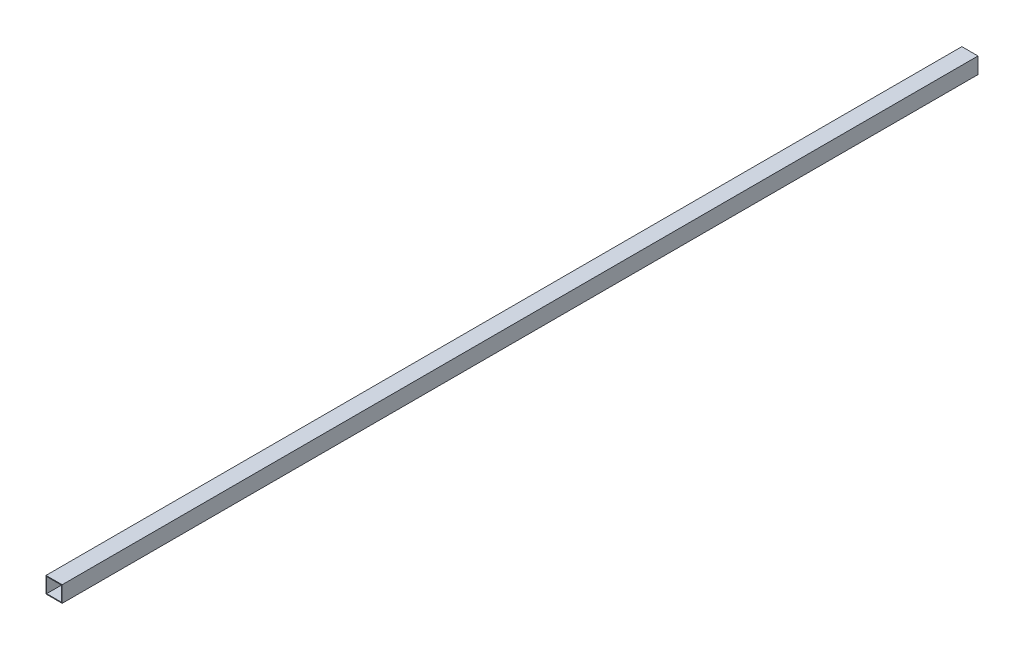
ISO-10303-21;
HEADER;
FILE_DESCRIPTION(('STEP AP214'),'2;1');
FILE_NAME('part.step','',(''),(''),'','','');
FILE_SCHEMA(('AUTOMOTIVE_DESIGN { 1 0 10303 214 1 1 1 1 }'));
ENDSEC;
DATA;
#1=APPLICATION_CONTEXT('core data for automotive mechanical design processes');
#2=APPLICATION_PROTOCOL_DEFINITION('international standard','automotive_design',2000,#1);
#3=PRODUCT_CONTEXT('',#1,'mechanical');
#4=PRODUCT('Part','Part','',(#3));
#5=PRODUCT_RELATED_PRODUCT_CATEGORY('part','',(#4));
#6=PRODUCT_DEFINITION_FORMATION('','',#4);
#7=PRODUCT_DEFINITION_CONTEXT('part definition',#1,'design');
#8=PRODUCT_DEFINITION('design','',#6,#7);
#9=PRODUCT_DEFINITION_SHAPE('','',#8);
#10=(LENGTH_UNIT() NAMED_UNIT(*) SI_UNIT(.MILLI.,.METRE.));
#11=(NAMED_UNIT(*) PLANE_ANGLE_UNIT() SI_UNIT($,.RADIAN.));
#12=(NAMED_UNIT(*) SI_UNIT($,.STERADIAN.) SOLID_ANGLE_UNIT());
#13=UNCERTAINTY_MEASURE_WITH_UNIT(LENGTH_MEASURE(1.E-05),#10,'distance_accuracy_value','');
#14=(GEOMETRIC_REPRESENTATION_CONTEXT(3) GLOBAL_UNCERTAINTY_ASSIGNED_CONTEXT((#13)) GLOBAL_UNIT_ASSIGNED_CONTEXT((#10,
#11,#12)) REPRESENTATION_CONTEXT('',''));
#15=CARTESIAN_POINT('',(0.,0.,0.));
#16=DIRECTION('',(0.,0.,1.));
#17=DIRECTION('',(1.,0.,0.));
#18=AXIS2_PLACEMENT_3D('',#15,#16,#17);
#19=CARTESIAN_POINT('',(0.,0.,2159.));
#20=DIRECTION('',(0.,0.,-1.));
#21=DIRECTION('',(-1.,0.,0.));
#22=AXIS2_PLACEMENT_3D('',#19,#20,#21);
#23=PLANE('',#22);
#24=DIRECTION('',(0.,-1.,0.));
#25=VECTOR('',#24,1.);
#26=CARTESIAN_POINT('',(0.,0.,2159.));
#27=LINE('',#26,#25);
#28=CARTESIAN_POINT('',(0.,38.1,2159.));
#29=VERTEX_POINT('',#28);
#30=CARTESIAN_POINT('',(0.,0.,2159.));
#31=VERTEX_POINT('',#30);
#32=EDGE_CURVE('E134',#29,#31,#27,.T.);
#33=ORIENTED_EDGE('',*,*,#32,.T.);
#34=DIRECTION('',(1.,0.,0.));
#35=VECTOR('',#34,1.);
#36=CARTESIAN_POINT('',(0.,0.,2159.));
#37=LINE('',#36,#35);
#38=CARTESIAN_POINT('',(38.1,0.,2159.));
#39=VERTEX_POINT('',#38);
#40=EDGE_CURVE('E137',#31,#39,#37,.T.);
#41=ORIENTED_EDGE('',*,*,#40,.T.);
#42=DIRECTION('',(0.,1.,0.));
#43=VECTOR('',#42,1.);
#44=CARTESIAN_POINT('',(38.1,0.,2159.));
#45=LINE('',#44,#43);
#46=CARTESIAN_POINT('',(38.1,38.1,2159.));
#47=VERTEX_POINT('',#46);
#48=EDGE_CURVE('E140',#39,#47,#45,.T.);
#49=ORIENTED_EDGE('',*,*,#48,.T.);
#50=DIRECTION('',(-1.,0.,0.));
#51=VECTOR('',#50,1.);
#52=CARTESIAN_POINT('',(0.,38.1,2159.));
#53=LINE('',#52,#51);
#54=EDGE_CURVE('E142',#47,#29,#53,.T.);
#55=ORIENTED_EDGE('',*,*,#54,.T.);
#56=EDGE_LOOP('',(#33,#41,#49,#55));
#57=FACE_BOUND('',#56,.T.);
#58=DIRECTION('',(0.,-1.,0.));
#59=VECTOR('',#58,1.);
#60=CARTESIAN_POINT('',(1.5875,1.5875,2159.));
#61=LINE('',#60,#59);
#62=CARTESIAN_POINT('',(1.5875,36.5125,2159.));
#63=VERTEX_POINT('',#62);
#64=CARTESIAN_POINT('',(1.5875,1.5875,2159.));
#65=VERTEX_POINT('',#64);
#66=EDGE_CURVE('E98',#63,#65,#61,.T.);
#67=ORIENTED_EDGE('',*,*,#66,.F.);
#68=DIRECTION('',(-1.,0.,0.));
#69=VECTOR('',#68,1.);
#70=CARTESIAN_POINT('',(1.5875,36.5125,2159.));
#71=LINE('',#70,#69);
#72=CARTESIAN_POINT('',(36.5125,36.5125,2159.));
#73=VERTEX_POINT('',#72);
#74=EDGE_CURVE('E120',#73,#63,#71,.T.);
#75=ORIENTED_EDGE('',*,*,#74,.F.);
#76=DIRECTION('',(0.,1.,0.));
#77=VECTOR('',#76,1.);
#78=CARTESIAN_POINT('',(36.5125,1.5875,2159.));
#79=LINE('',#78,#77);
#80=CARTESIAN_POINT('',(36.5125,1.5875,2159.));
#81=VERTEX_POINT('',#80);
#82=EDGE_CURVE('E118',#81,#73,#79,.T.);
#83=ORIENTED_EDGE('',*,*,#82,.F.);
#84=DIRECTION('',(1.,0.,0.));
#85=VECTOR('',#84,1.);
#86=CARTESIAN_POINT('',(1.5875,1.5875,2159.));
#87=LINE('',#86,#85);
#88=EDGE_CURVE('E106',#65,#81,#87,.T.);
#89=ORIENTED_EDGE('',*,*,#88,.F.);
#90=EDGE_LOOP('',(#67,#75,#83,#89));
#91=FACE_BOUND('',#90,.T.);
#92=ADVANCED_FACE('F33',(#57,#91),#23,.F.);
#93=CARTESIAN_POINT('',(0.,0.,0.));
#94=DIRECTION('',(0.,0.,-1.));
#95=DIRECTION('',(-1.,0.,0.));
#96=AXIS2_PLACEMENT_3D('',#93,#94,#95);
#97=PLANE('',#96);
#98=DIRECTION('',(0.,-1.,0.));
#99=VECTOR('',#98,1.);
#100=CARTESIAN_POINT('',(0.,0.,0.));
#101=LINE('',#100,#99);
#102=CARTESIAN_POINT('',(0.,38.1,0.));
#103=VERTEX_POINT('',#102);
#104=CARTESIAN_POINT('',(0.,0.,0.));
#105=VERTEX_POINT('',#104);
#106=EDGE_CURVE('E114',#103,#105,#101,.T.);
#107=ORIENTED_EDGE('',*,*,#106,.F.);
#108=DIRECTION('',(-1.,0.,0.));
#109=VECTOR('',#108,1.);
#110=CARTESIAN_POINT('',(0.,38.1,0.));
#111=LINE('',#110,#109);
#112=CARTESIAN_POINT('',(38.1,38.1,0.));
#113=VERTEX_POINT('',#112);
#114=EDGE_CURVE('E138',#113,#103,#111,.T.);
#115=ORIENTED_EDGE('',*,*,#114,.F.);
#116=DIRECTION('',(0.,1.,0.));
#117=VECTOR('',#116,1.);
#118=CARTESIAN_POINT('',(38.1,0.,0.));
#119=LINE('',#118,#117);
#120=CARTESIAN_POINT('',(38.1,0.,0.));
#121=VERTEX_POINT('',#120);
#122=EDGE_CURVE('E149',#121,#113,#119,.T.);
#123=ORIENTED_EDGE('',*,*,#122,.F.);
#124=DIRECTION('',(1.,0.,0.));
#125=VECTOR('',#124,1.);
#126=CARTESIAN_POINT('',(0.,0.,0.));
#127=LINE('',#126,#125);
#128=EDGE_CURVE('E147',#105,#121,#127,.T.);
#129=ORIENTED_EDGE('',*,*,#128,.F.);
#130=EDGE_LOOP('',(#107,#115,#123,#129));
#131=FACE_BOUND('',#130,.T.);
#132=DIRECTION('',(-1.,0.,0.));
#133=VECTOR('',#132,1.);
#134=CARTESIAN_POINT('',(1.5875,36.5125,0.));
#135=LINE('',#134,#133);
#136=CARTESIAN_POINT('',(36.5125,36.5125,0.));
#137=VERTEX_POINT('',#136);
#138=CARTESIAN_POINT('',(1.5875,36.5125,0.));
#139=VERTEX_POINT('',#138);
#140=EDGE_CURVE('E107',#137,#139,#135,.T.);
#141=ORIENTED_EDGE('',*,*,#140,.T.);
#142=DIRECTION('',(0.,-1.,0.));
#143=VECTOR('',#142,1.);
#144=CARTESIAN_POINT('',(1.5875,1.5875,0.));
#145=LINE('',#144,#143);
#146=CARTESIAN_POINT('',(1.5875,1.5875,0.));
#147=VERTEX_POINT('',#146);
#148=EDGE_CURVE('E56',#139,#147,#145,.T.);
#149=ORIENTED_EDGE('',*,*,#148,.T.);
#150=DIRECTION('',(1.,0.,0.));
#151=VECTOR('',#150,1.);
#152=CARTESIAN_POINT('',(1.5875,1.5875,0.));
#153=LINE('',#152,#151);
#154=CARTESIAN_POINT('',(36.5125,1.5875,0.));
#155=VERTEX_POINT('',#154);
#156=EDGE_CURVE('E113',#147,#155,#153,.T.);
#157=ORIENTED_EDGE('',*,*,#156,.T.);
#158=DIRECTION('',(0.,1.,0.));
#159=VECTOR('',#158,1.);
#160=CARTESIAN_POINT('',(36.5125,1.5875,0.));
#161=LINE('',#160,#159);
#162=EDGE_CURVE('E126',#155,#137,#161,.T.);
#163=ORIENTED_EDGE('',*,*,#162,.T.);
#164=EDGE_LOOP('',(#141,#149,#157,#163));
#165=FACE_BOUND('',#164,.T.);
#166=ADVANCED_FACE('F167',(#131,#165),#97,.T.);
#167=CARTESIAN_POINT('',(0.,0.,2159.));
#168=DIRECTION('',(1.,0.,0.));
#169=DIRECTION('',(0.,0.,-1.));
#170=AXIS2_PLACEMENT_3D('',#167,#168,#169);
#171=PLANE('',#170);
#172=ORIENTED_EDGE('',*,*,#106,.T.);
#173=DIRECTION('',(0.,0.,-1.));
#174=VECTOR('',#173,1.);
#175=CARTESIAN_POINT('',(0.,0.,2159.));
#176=LINE('',#175,#174);
#177=EDGE_CURVE('E11',#31,#105,#176,.T.);
#178=ORIENTED_EDGE('',*,*,#177,.F.);
#179=ORIENTED_EDGE('',*,*,#32,.F.);
#180=DIRECTION('',(0.,0.,-1.));
#181=VECTOR('',#180,1.);
#182=CARTESIAN_POINT('',(0.,38.1,2159.));
#183=LINE('',#182,#181);
#184=EDGE_CURVE('E144',#29,#103,#183,.T.);
#185=ORIENTED_EDGE('',*,*,#184,.T.);
#186=EDGE_LOOP('',(#172,#178,#179,#185));
#187=FACE_BOUND('',#186,.T.);
#188=ADVANCED_FACE('F35',(#187),#171,.F.);
#189=CARTESIAN_POINT('',(0.,0.,2159.));
#190=DIRECTION('',(0.,1.,0.));
#191=DIRECTION('',(0.,0.,1.));
#192=AXIS2_PLACEMENT_3D('',#189,#190,#191);
#193=PLANE('',#192);
#194=ORIENTED_EDGE('',*,*,#128,.T.);
#195=DIRECTION('',(0.,0.,-1.));
#196=VECTOR('',#195,1.);
#197=CARTESIAN_POINT('',(38.1,0.,2159.));
#198=LINE('',#197,#196);
#199=EDGE_CURVE('E41',#39,#121,#198,.T.);
#200=ORIENTED_EDGE('',*,*,#199,.F.);
#201=ORIENTED_EDGE('',*,*,#40,.F.);
#202=ORIENTED_EDGE('',*,*,#177,.T.);
#203=EDGE_LOOP('',(#194,#200,#201,#202));
#204=FACE_BOUND('',#203,.T.);
#205=ADVANCED_FACE('F177',(#204),#193,.F.);
#206=CARTESIAN_POINT('',(38.1,0.,2159.));
#207=DIRECTION('',(-1.,0.,0.));
#208=DIRECTION('',(0.,0.,1.));
#209=AXIS2_PLACEMENT_3D('',#206,#207,#208);
#210=PLANE('',#209);
#211=ORIENTED_EDGE('',*,*,#122,.T.);
#212=DIRECTION('',(0.,0.,-1.));
#213=VECTOR('',#212,1.);
#214=CARTESIAN_POINT('',(38.1,38.1,2159.));
#215=LINE('',#214,#213);
#216=EDGE_CURVE('E154',#47,#113,#215,.T.);
#217=ORIENTED_EDGE('',*,*,#216,.F.);
#218=ORIENTED_EDGE('',*,*,#48,.F.);
#219=ORIENTED_EDGE('',*,*,#199,.T.);
#220=EDGE_LOOP('',(#211,#217,#218,#219));
#221=FACE_BOUND('',#220,.T.);
#222=ADVANCED_FACE('F161',(#221),#210,.F.);
#223=CARTESIAN_POINT('',(0.,38.1,2159.));
#224=DIRECTION('',(0.,-1.,0.));
#225=DIRECTION('',(0.,0.,-1.));
#226=AXIS2_PLACEMENT_3D('',#223,#224,#225);
#227=PLANE('',#226);
#228=ORIENTED_EDGE('',*,*,#114,.T.);
#229=ORIENTED_EDGE('',*,*,#184,.F.);
#230=ORIENTED_EDGE('',*,*,#54,.F.);
#231=ORIENTED_EDGE('',*,*,#216,.T.);
#232=EDGE_LOOP('',(#228,#229,#230,#231));
#233=FACE_BOUND('',#232,.T.);
#234=ADVANCED_FACE('F171',(#233),#227,.F.);
#235=CARTESIAN_POINT('',(1.5875,1.5875,2159.));
#236=DIRECTION('',(1.,0.,0.));
#237=DIRECTION('',(0.,1.,0.));
#238=AXIS2_PLACEMENT_3D('',#235,#236,#237);
#239=PLANE('',#238);
#240=ORIENTED_EDGE('',*,*,#148,.F.);
#241=DIRECTION('',(0.,0.,-1.));
#242=VECTOR('',#241,1.);
#243=CARTESIAN_POINT('',(1.5875,36.5125,2159.));
#244=LINE('',#243,#242);
#245=EDGE_CURVE('E102',#63,#139,#244,.T.);
#246=ORIENTED_EDGE('',*,*,#245,.F.);
#247=ORIENTED_EDGE('',*,*,#66,.T.);
#248=DIRECTION('',(0.,0.,-1.));
#249=VECTOR('',#248,1.);
#250=CARTESIAN_POINT('',(1.5875,1.5875,2159.));
#251=LINE('',#250,#249);
#252=EDGE_CURVE('E101',#65,#147,#251,.T.);
#253=ORIENTED_EDGE('',*,*,#252,.T.);
#254=EDGE_LOOP('',(#240,#246,#247,#253));
#255=FACE_BOUND('',#254,.T.);
#256=ADVANCED_FACE('F100',(#255),#239,.T.);
#257=CARTESIAN_POINT('',(1.5875,1.5875,2159.));
#258=DIRECTION('',(0.,1.,0.));
#259=DIRECTION('',(0.,0.,1.));
#260=AXIS2_PLACEMENT_3D('',#257,#258,#259);
#261=PLANE('',#260);
#262=ORIENTED_EDGE('',*,*,#156,.F.);
#263=ORIENTED_EDGE('',*,*,#252,.F.);
#264=ORIENTED_EDGE('',*,*,#88,.T.);
#265=DIRECTION('',(0.,0.,-1.));
#266=VECTOR('',#265,1.);
#267=CARTESIAN_POINT('',(36.5125,1.5875,2159.));
#268=LINE('',#267,#266);
#269=EDGE_CURVE('E115',#81,#155,#268,.T.);
#270=ORIENTED_EDGE('',*,*,#269,.T.);
#271=EDGE_LOOP('',(#262,#263,#264,#270));
#272=FACE_BOUND('',#271,.T.);
#273=ADVANCED_FACE('F110',(#272),#261,.T.);
#274=CARTESIAN_POINT('',(36.5125,1.5875,2159.));
#275=DIRECTION('',(-1.,0.,0.));
#276=DIRECTION('',(0.,0.,1.));
#277=AXIS2_PLACEMENT_3D('',#274,#275,#276);
#278=PLANE('',#277);
#279=ORIENTED_EDGE('',*,*,#162,.F.);
#280=ORIENTED_EDGE('',*,*,#269,.F.);
#281=ORIENTED_EDGE('',*,*,#82,.T.);
#282=DIRECTION('',(0.,0.,-1.));
#283=VECTOR('',#282,1.);
#284=CARTESIAN_POINT('',(36.5125,36.5125,2159.));
#285=LINE('',#284,#283);
#286=EDGE_CURVE('E48',#73,#137,#285,.T.);
#287=ORIENTED_EDGE('',*,*,#286,.T.);
#288=EDGE_LOOP('',(#279,#280,#281,#287));
#289=FACE_BOUND('',#288,.T.);
#290=ADVANCED_FACE('F200',(#289),#278,.T.);
#291=CARTESIAN_POINT('',(1.5875,36.5125,2159.));
#292=DIRECTION('',(0.,-1.,0.));
#293=DIRECTION('',(0.,0.,-1.));
#294=AXIS2_PLACEMENT_3D('',#291,#292,#293);
#295=PLANE('',#294);
#296=ORIENTED_EDGE('',*,*,#140,.F.);
#297=ORIENTED_EDGE('',*,*,#286,.F.);
#298=ORIENTED_EDGE('',*,*,#74,.T.);
#299=ORIENTED_EDGE('',*,*,#245,.T.);
#300=EDGE_LOOP('',(#296,#297,#298,#299));
#301=FACE_BOUND('',#300,.T.);
#302=ADVANCED_FACE('F204',(#301),#295,.T.);
#303=CLOSED_SHELL('',(#92,#166,#188,#205,#222,#234,#256,#273,#290,#302));
#304=MANIFOLD_SOLID_BREP('B2',#303);
#305=ADVANCED_BREP_SHAPE_REPRESENTATION('',(#18,#304),#14);
#306=SHAPE_DEFINITION_REPRESENTATION(#9,#305);
ENDSEC;
END-ISO-10303-21;
